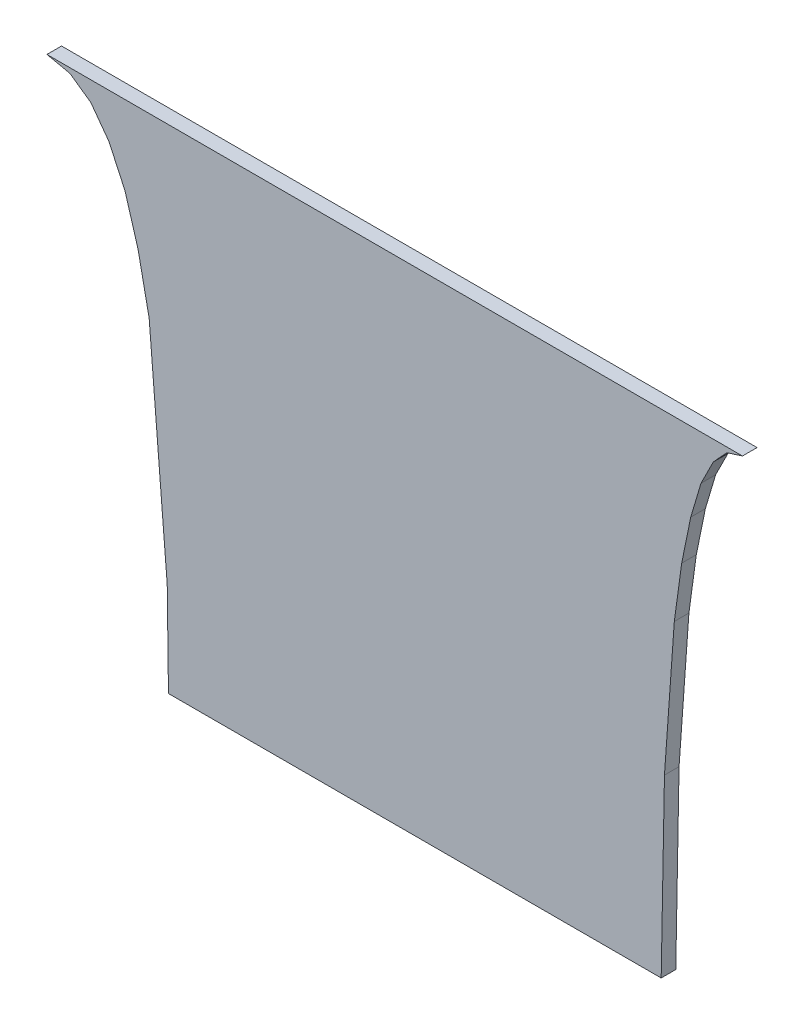
ISO-10303-21;
HEADER;
FILE_DESCRIPTION(('STEP AP214'),'2;1');
FILE_NAME('part.step','',(''),(''),'','','');
FILE_SCHEMA(('AUTOMOTIVE_DESIGN { 1 0 10303 214 1 1 1 1 }'));
ENDSEC;
DATA;
#1=APPLICATION_CONTEXT('core data for automotive mechanical design processes');
#2=APPLICATION_PROTOCOL_DEFINITION('international standard','automotive_design',2000,#1);
#3=PRODUCT_CONTEXT('',#1,'mechanical');
#4=PRODUCT('Part','Part','',(#3));
#5=PRODUCT_RELATED_PRODUCT_CATEGORY('part','',(#4));
#6=PRODUCT_DEFINITION_FORMATION('','',#4);
#7=PRODUCT_DEFINITION_CONTEXT('part definition',#1,'design');
#8=PRODUCT_DEFINITION('design','',#6,#7);
#9=PRODUCT_DEFINITION_SHAPE('','',#8);
#10=(LENGTH_UNIT() NAMED_UNIT(*) SI_UNIT(.MILLI.,.METRE.));
#11=(NAMED_UNIT(*) PLANE_ANGLE_UNIT() SI_UNIT($,.RADIAN.));
#12=(NAMED_UNIT(*) SI_UNIT($,.STERADIAN.) SOLID_ANGLE_UNIT());
#13=UNCERTAINTY_MEASURE_WITH_UNIT(LENGTH_MEASURE(1.E-05),#10,'distance_accuracy_value','');
#14=(GEOMETRIC_REPRESENTATION_CONTEXT(3) GLOBAL_UNCERTAINTY_ASSIGNED_CONTEXT((#13)) GLOBAL_UNIT_ASSIGNED_CONTEXT((#10,
#11,#12)) REPRESENTATION_CONTEXT('',''));
#15=CARTESIAN_POINT('',(0.,0.,0.));
#16=DIRECTION('',(0.,0.,1.));
#17=DIRECTION('',(1.,0.,0.));
#18=AXIS2_PLACEMENT_3D('',#15,#16,#17);
#19=CARTESIAN_POINT('',(67.4290008544922,88.5329971313477,0.));
#20=DIRECTION('',(-0.999828763927862,0.0185052106846405,0.));
#21=DIRECTION('',(0.0185052106846405,0.999828763927862,0.));
#22=AXIS2_PLACEMENT_3D('',#19,#20,#21);
#23=PLANE('',#22);
#24=DIRECTION('',(0.0185052106846405,0.999828763927862,0.));
#25=VECTOR('',#24,1.);
#26=CARTESIAN_POINT('',(67.4290008544922,88.5329971313477,0.03556));
#27=LINE('',#26,#25);
#28=CARTESIAN_POINT('',(67.4290008544922,88.5329971313477,0.03556));
#29=VERTEX_POINT('',#28);
#30=CARTESIAN_POINT('',(67.4369964599609,88.9649963378906,0.03556));
#31=VERTEX_POINT('',#30);
#32=EDGE_CURVE('E11',#29,#31,#27,.T.);
#33=ORIENTED_EDGE('',*,*,#32,.F.);
#34=DIRECTION('',(0.,0.,1.));
#35=VECTOR('',#34,1.);
#36=CARTESIAN_POINT('',(67.4290008544922,88.5329971313477,0.));
#37=LINE('',#36,#35);
#38=CARTESIAN_POINT('',(67.4290008544922,88.5329971313477,0.));
#39=VERTEX_POINT('',#38);
#40=EDGE_CURVE('E24',#39,#29,#37,.T.);
#41=ORIENTED_EDGE('',*,*,#40,.F.);
#42=DIRECTION('',(0.0185052106846405,0.999828763927862,0.));
#43=VECTOR('',#42,1.);
#44=CARTESIAN_POINT('',(67.4290008544922,88.5329971313477,0.));
#45=LINE('',#44,#43);
#46=CARTESIAN_POINT('',(67.4369964599609,88.9649963378906,0.));
#47=VERTEX_POINT('',#46);
#48=EDGE_CURVE('E160',#39,#47,#45,.T.);
#49=ORIENTED_EDGE('',*,*,#48,.T.);
#50=DIRECTION('',(0.,0.,1.));
#51=VECTOR('',#50,1.);
#52=CARTESIAN_POINT('',(67.4369964599609,88.9649963378906,0.));
#53=LINE('',#52,#51);
#54=EDGE_CURVE('E37',#47,#31,#53,.T.);
#55=ORIENTED_EDGE('',*,*,#54,.T.);
#56=EDGE_LOOP('',(#33,#41,#49,#55));
#57=FACE_BOUND('',#56,.T.);
#58=ADVANCED_FACE('F17',(#57),#23,.F.);
#59=CARTESIAN_POINT('',(67.4369964599609,88.9649963378906,0.));
#60=DIRECTION('',(-0.997458354919496,0.0712518785807937,0.));
#61=DIRECTION('',(0.0712518785807937,0.997458354919496,0.));
#62=AXIS2_PLACEMENT_3D('',#59,#60,#61);
#63=PLANE('',#62);
#64=DIRECTION('',(0.0712518785807937,0.997458354919496,0.));
#65=VECTOR('',#64,1.);
#66=CARTESIAN_POINT('',(67.4369964599609,88.9649963378906,0.03556));
#67=LINE('',#66,#65);
#68=CARTESIAN_POINT('',(67.4609985351562,89.3010025024414,0.03556));
#69=VERTEX_POINT('',#68);
#70=EDGE_CURVE('E280',#31,#69,#67,.T.);
#71=ORIENTED_EDGE('',*,*,#70,.F.);
#72=ORIENTED_EDGE('',*,*,#54,.F.);
#73=DIRECTION('',(0.0712518785807937,0.997458354919496,0.));
#74=VECTOR('',#73,1.);
#75=CARTESIAN_POINT('',(67.4369964599609,88.9649963378906,0.));
#76=LINE('',#75,#74);
#77=CARTESIAN_POINT('',(67.4609985351562,89.3010025024414,0.));
#78=VERTEX_POINT('',#77);
#79=EDGE_CURVE('E277',#47,#78,#76,.T.);
#80=ORIENTED_EDGE('',*,*,#79,.T.);
#81=DIRECTION('',(0.,0.,1.));
#82=VECTOR('',#81,1.);
#83=CARTESIAN_POINT('',(67.4609985351562,89.3010025024414,0.));
#84=LINE('',#83,#82);
#85=EDGE_CURVE('E275',#78,#69,#84,.T.);
#86=ORIENTED_EDGE('',*,*,#85,.T.);
#87=EDGE_LOOP('',(#71,#72,#80,#86));
#88=FACE_BOUND('',#87,.T.);
#89=ADVANCED_FACE('F288',(#88),#63,.F.);
#90=CARTESIAN_POINT('',(67.4609985351562,89.3010025024414,0.));
#91=DIRECTION('',(-0.990831910463232,0.135100426378982,0.));
#92=DIRECTION('',(0.135100426378982,0.990831910463232,0.));
#93=AXIS2_PLACEMENT_3D('',#90,#91,#92);
#94=PLANE('',#93);
#95=DIRECTION('',(0.135100426378982,0.990831910463231,0.));
#96=VECTOR('',#95,1.);
#97=CARTESIAN_POINT('',(67.4609985351562,89.3010025024414,0.03556));
#98=LINE('',#97,#96);
#99=CARTESIAN_POINT('',(67.4789962768555,89.4329986572265,0.03556));
#100=VERTEX_POINT('',#99);
#101=EDGE_CURVE('E272',#69,#100,#98,.T.);
#102=ORIENTED_EDGE('',*,*,#101,.F.);
#103=ORIENTED_EDGE('',*,*,#85,.F.);
#104=DIRECTION('',(0.135100426378982,0.990831910463231,0.));
#105=VECTOR('',#104,1.);
#106=CARTESIAN_POINT('',(67.4609985351562,89.3010025024414,0.));
#107=LINE('',#106,#105);
#108=CARTESIAN_POINT('',(67.4789962768555,89.4329986572265,0.));
#109=VERTEX_POINT('',#108);
#110=EDGE_CURVE('E269',#78,#109,#107,.T.);
#111=ORIENTED_EDGE('',*,*,#110,.T.);
#112=DIRECTION('',(0.,0.,1.));
#113=VECTOR('',#112,1.);
#114=CARTESIAN_POINT('',(67.4789962768555,89.4329986572265,0.));
#115=LINE('',#114,#113);
#116=EDGE_CURVE('E267',#109,#100,#115,.T.);
#117=ORIENTED_EDGE('',*,*,#116,.T.);
#118=EDGE_LOOP('',(#102,#103,#111,#117));
#119=FACE_BOUND('',#118,.T.);
#120=ADVANCED_FACE('F294',(#119),#94,.F.);
#121=CARTESIAN_POINT('',(67.4789962768555,89.4329986572265,0.));
#122=DIRECTION('',(-0.979871534143143,0.199629097518284,0.));
#123=DIRECTION('',(0.199629097518284,0.979871534143143,0.));
#124=AXIS2_PLACEMENT_3D('',#121,#122,#123);
#125=PLANE('',#124);
#126=DIRECTION('',(0.199629097518284,0.979871534143143,0.));
#127=VECTOR('',#126,1.);
#128=CARTESIAN_POINT('',(67.4789962768555,89.4329986572265,0.03556));
#129=LINE('',#128,#127);
#130=CARTESIAN_POINT('',(67.5009994506836,89.5410003662109,0.03556));
#131=VERTEX_POINT('',#130);
#132=EDGE_CURVE('E264',#100,#131,#129,.T.);
#133=ORIENTED_EDGE('',*,*,#132,.F.);
#134=ORIENTED_EDGE('',*,*,#116,.F.);
#135=DIRECTION('',(0.199629097518284,0.979871534143143,0.));
#136=VECTOR('',#135,1.);
#137=CARTESIAN_POINT('',(67.4789962768555,89.4329986572265,0.));
#138=LINE('',#137,#136);
#139=CARTESIAN_POINT('',(67.5009994506836,89.5410003662109,0.));
#140=VERTEX_POINT('',#139);
#141=EDGE_CURVE('E261',#109,#140,#138,.T.);
#142=ORIENTED_EDGE('',*,*,#141,.T.);
#143=DIRECTION('',(0.,0.,1.));
#144=VECTOR('',#143,1.);
#145=CARTESIAN_POINT('',(67.5009994506836,89.5410003662109,0.));
#146=LINE('',#145,#144);
#147=EDGE_CURVE('E259',#140,#131,#146,.T.);
#148=ORIENTED_EDGE('',*,*,#147,.T.);
#149=EDGE_LOOP('',(#133,#134,#142,#148));
#150=FACE_BOUND('',#149,.T.);
#151=ADVANCED_FACE('F296',(#150),#125,.F.);
#152=CARTESIAN_POINT('',(67.5009994506836,89.541000366211,0.));
#153=DIRECTION('',(-0.958446978225307,0.285270730939539,0.));
#154=DIRECTION('',(0.285270730939539,0.958446978225307,0.));
#155=AXIS2_PLACEMENT_3D('',#152,#153,#154);
#156=PLANE('',#155);
#157=DIRECTION('',(0.285270730939539,0.958446978225306,0.));
#158=VECTOR('',#157,1.);
#159=CARTESIAN_POINT('',(67.5009994506836,89.5410003662109,0.03556));
#160=LINE('',#159,#158);
#161=CARTESIAN_POINT('',(67.5260009765625,89.625,0.03556));
#162=VERTEX_POINT('',#161);
#163=EDGE_CURVE('E256',#131,#162,#160,.T.);
#164=ORIENTED_EDGE('',*,*,#163,.F.);
#165=ORIENTED_EDGE('',*,*,#147,.F.);
#166=DIRECTION('',(0.285270730939539,0.958446978225306,0.));
#167=VECTOR('',#166,1.);
#168=CARTESIAN_POINT('',(67.5009994506836,89.5410003662109,0.));
#169=LINE('',#168,#167);
#170=CARTESIAN_POINT('',(67.5260009765625,89.625,0.));
#171=VERTEX_POINT('',#170);
#172=EDGE_CURVE('E253',#140,#171,#169,.T.);
#173=ORIENTED_EDGE('',*,*,#172,.T.);
#174=DIRECTION('',(0.,0.,1.));
#175=VECTOR('',#174,1.);
#176=CARTESIAN_POINT('',(67.5260009765625,89.625,0.));
#177=LINE('',#176,#175);
#178=EDGE_CURVE('E251',#171,#162,#177,.T.);
#179=ORIENTED_EDGE('',*,*,#178,.T.);
#180=EDGE_LOOP('',(#164,#165,#173,#179));
#181=FACE_BOUND('',#180,.T.);
#182=ADVANCED_FACE('F301',(#181),#156,.F.);
#183=CARTESIAN_POINT('',(67.5260009765625,89.625,0.));
#184=DIRECTION('',(-0.894427190999916,0.447213595499958,0.));
#185=DIRECTION('',(0.447213595499958,0.894427190999916,0.));
#186=AXIS2_PLACEMENT_3D('',#183,#184,#185);
#187=PLANE('',#186);
#188=DIRECTION('',(0.447213595499958,0.894427190999916,0.));
#189=VECTOR('',#188,1.);
#190=CARTESIAN_POINT('',(67.5260009765625,89.625,0.03556));
#191=LINE('',#190,#189);
#192=CARTESIAN_POINT('',(67.5559997558594,89.6849975585938,0.03556));
#193=VERTEX_POINT('',#192);
#194=EDGE_CURVE('E248',#162,#193,#191,.T.);
#195=ORIENTED_EDGE('',*,*,#194,.F.);
#196=ORIENTED_EDGE('',*,*,#178,.F.);
#197=DIRECTION('',(0.447213595499958,0.894427190999916,0.));
#198=VECTOR('',#197,1.);
#199=CARTESIAN_POINT('',(67.5260009765625,89.625,0.));
#200=LINE('',#199,#198);
#201=CARTESIAN_POINT('',(67.5559997558594,89.6849975585938,0.));
#202=VERTEX_POINT('',#201);
#203=EDGE_CURVE('E245',#171,#202,#200,.T.);
#204=ORIENTED_EDGE('',*,*,#203,.T.);
#205=DIRECTION('',(0.,0.,1.));
#206=VECTOR('',#205,1.);
#207=CARTESIAN_POINT('',(67.5559997558594,89.6849975585938,0.));
#208=LINE('',#207,#206);
#209=EDGE_CURVE('E243',#202,#193,#208,.T.);
#210=ORIENTED_EDGE('',*,*,#209,.T.);
#211=EDGE_LOOP('',(#195,#196,#204,#210));
#212=FACE_BOUND('',#211,.T.);
#213=ADVANCED_FACE('F304',(#212),#187,.F.);
#214=CARTESIAN_POINT('',(67.5559997558594,89.6849975585938,0.));
#215=DIRECTION('',(-0.73721249970218,0.675660958086867,0.));
#216=DIRECTION('',(0.675660958086867,0.73721249970218,0.));
#217=AXIS2_PLACEMENT_3D('',#214,#215,#216);
#218=PLANE('',#217);
#219=DIRECTION('',(0.675660958086867,0.73721249970218,0.));
#220=VECTOR('',#219,1.);
#221=CARTESIAN_POINT('',(67.5559997558594,89.6849975585938,0.03556));
#222=LINE('',#221,#220);
#223=CARTESIAN_POINT('',(67.588996887207,89.7210006713867,0.03556));
#224=VERTEX_POINT('',#223);
#225=EDGE_CURVE('E240',#193,#224,#222,.T.);
#226=ORIENTED_EDGE('',*,*,#225,.F.);
#227=ORIENTED_EDGE('',*,*,#209,.F.);
#228=DIRECTION('',(0.675660958086867,0.73721249970218,0.));
#229=VECTOR('',#228,1.);
#230=CARTESIAN_POINT('',(67.5559997558594,89.6849975585938,0.));
#231=LINE('',#230,#229);
#232=CARTESIAN_POINT('',(67.588996887207,89.7210006713867,0.));
#233=VERTEX_POINT('',#232);
#234=EDGE_CURVE('E237',#202,#233,#231,.T.);
#235=ORIENTED_EDGE('',*,*,#234,.T.);
#236=DIRECTION('',(0.,0.,1.));
#237=VECTOR('',#236,1.);
#238=CARTESIAN_POINT('',(67.588996887207,89.7210006713867,0.));
#239=LINE('',#238,#237);
#240=EDGE_CURVE('E235',#233,#224,#239,.T.);
#241=ORIENTED_EDGE('',*,*,#240,.T.);
#242=EDGE_LOOP('',(#226,#227,#235,#241));
#243=FACE_BOUND('',#242,.T.);
#244=ADVANCED_FACE('F309',(#243),#218,.F.);
#245=CARTESIAN_POINT('',(67.588996887207,89.7210006713867,0.));
#246=DIRECTION('',(-0.301140530203673,0.953579771738396,0.));
#247=DIRECTION('',(0.953579771738396,0.301140530203673,0.));
#248=AXIS2_PLACEMENT_3D('',#245,#246,#247);
#249=PLANE('',#248);
#250=DIRECTION('',(0.953579771738395,0.301140530203673,0.));
#251=VECTOR('',#250,1.);
#252=CARTESIAN_POINT('',(67.588996887207,89.7210006713867,0.03556));
#253=LINE('',#252,#251);
#254=CARTESIAN_POINT('',(67.6269989013672,89.7330017089844,0.03556));
#255=VERTEX_POINT('',#254);
#256=EDGE_CURVE('E232',#224,#255,#253,.T.);
#257=ORIENTED_EDGE('',*,*,#256,.F.);
#258=ORIENTED_EDGE('',*,*,#240,.F.);
#259=DIRECTION('',(0.953579771738395,0.301140530203673,0.));
#260=VECTOR('',#259,1.);
#261=CARTESIAN_POINT('',(67.588996887207,89.7210006713867,0.));
#262=LINE('',#261,#260);
#263=CARTESIAN_POINT('',(67.6269989013672,89.7330017089844,0.));
#264=VERTEX_POINT('',#263);
#265=EDGE_CURVE('E229',#233,#264,#262,.T.);
#266=ORIENTED_EDGE('',*,*,#265,.T.);
#267=DIRECTION('',(0.,0.,1.));
#268=VECTOR('',#267,1.);
#269=CARTESIAN_POINT('',(67.6269989013672,89.7330017089844,0.));
#270=LINE('',#269,#268);
#271=EDGE_CURVE('E227',#264,#255,#270,.T.);
#272=ORIENTED_EDGE('',*,*,#271,.T.);
#273=EDGE_LOOP('',(#257,#258,#266,#272));
#274=FACE_BOUND('',#273,.T.);
#275=ADVANCED_FACE('F312',(#274),#249,.F.);
#276=CARTESIAN_POINT('',(67.6269989013672,89.7330017089844,0.));
#277=DIRECTION('',(0.,-1.,0.));
#278=DIRECTION('',(-1.,0.,0.));
#279=AXIS2_PLACEMENT_3D('',#276,#277,#278);
#280=PLANE('',#279);
#281=DIRECTION('',(-1.,0.,0.));
#282=VECTOR('',#281,1.);
#283=CARTESIAN_POINT('',(67.6269989013672,89.7330017089844,0.03556));
#284=LINE('',#283,#282);
#285=CARTESIAN_POINT('',(65.9329986572266,89.7330017089844,0.03556));
#286=VERTEX_POINT('',#285);
#287=EDGE_CURVE('E224',#255,#286,#284,.T.);
#288=ORIENTED_EDGE('',*,*,#287,.F.);
#289=ORIENTED_EDGE('',*,*,#271,.F.);
#290=DIRECTION('',(-1.,0.,0.));
#291=VECTOR('',#290,1.);
#292=CARTESIAN_POINT('',(67.6269989013672,89.7330017089844,0.));
#293=LINE('',#292,#291);
#294=CARTESIAN_POINT('',(65.9329986572266,89.7330017089844,0.));
#295=VERTEX_POINT('',#294);
#296=EDGE_CURVE('E221',#264,#295,#293,.T.);
#297=ORIENTED_EDGE('',*,*,#296,.T.);
#298=DIRECTION('',(0.,0.,1.));
#299=VECTOR('',#298,1.);
#300=CARTESIAN_POINT('',(65.9329986572266,89.7330017089844,0.));
#301=LINE('',#300,#299);
#302=EDGE_CURVE('E219',#295,#286,#301,.T.);
#303=ORIENTED_EDGE('',*,*,#302,.T.);
#304=EDGE_LOOP('',(#288,#289,#297,#303));
#305=FACE_BOUND('',#304,.T.);
#306=ADVANCED_FACE('F317',(#305),#280,.F.);
#307=CARTESIAN_POINT('',(65.9329986572266,89.7330017089844,0.));
#308=DIRECTION('',(0.20954728392183,0.977798514930854,0.));
#309=DIRECTION('',(0.977798514930854,-0.20954728392183,0.));
#310=AXIS2_PLACEMENT_3D('',#307,#308,#309);
#311=PLANE('',#310);
#312=DIRECTION('',(0.977798514930854,-0.20954728392183,0.));
#313=VECTOR('',#312,1.);
#314=CARTESIAN_POINT('',(65.9329986572266,89.7330017089844,0.03556));
#315=LINE('',#314,#313);
#316=CARTESIAN_POINT('',(65.9889984130859,89.7210006713867,0.03556));
#317=VERTEX_POINT('',#316);
#318=EDGE_CURVE('E216',#286,#317,#315,.T.);
#319=ORIENTED_EDGE('',*,*,#318,.F.);
#320=ORIENTED_EDGE('',*,*,#302,.F.);
#321=DIRECTION('',(0.977798514930854,-0.20954728392183,0.));
#322=VECTOR('',#321,1.);
#323=CARTESIAN_POINT('',(65.9329986572266,89.7330017089844,0.));
#324=LINE('',#323,#322);
#325=CARTESIAN_POINT('',(65.9889984130859,89.7210006713867,0.));
#326=VERTEX_POINT('',#325);
#327=EDGE_CURVE('E213',#295,#326,#324,.T.);
#328=ORIENTED_EDGE('',*,*,#327,.T.);
#329=DIRECTION('',(0.,0.,1.));
#330=VECTOR('',#329,1.);
#331=CARTESIAN_POINT('',(65.9889984130859,89.7210006713867,0.));
#332=LINE('',#331,#330);
#333=EDGE_CURVE('E211',#326,#317,#332,.T.);
#334=ORIENTED_EDGE('',*,*,#333,.T.);
#335=EDGE_LOOP('',(#319,#320,#328,#334));
#336=FACE_BOUND('',#335,.T.);
#337=ADVANCED_FACE('F320',(#336),#311,.F.);
#338=CARTESIAN_POINT('',(65.9889984130859,89.7210006713867,0.));
#339=DIRECTION('',(0.576697591474071,0.816957702692131,0.));
#340=DIRECTION('',(0.816957702692131,-0.576697591474071,0.));
#341=AXIS2_PLACEMENT_3D('',#338,#339,#340);
#342=PLANE('',#341);
#343=DIRECTION('',(0.816957702692131,-0.576697591474071,0.));
#344=VECTOR('',#343,1.);
#345=CARTESIAN_POINT('',(65.9889984130859,89.7210006713867,0.03556));
#346=LINE('',#345,#344);
#347=CARTESIAN_POINT('',(66.0400009155273,89.6849975585938,0.03556));
#348=VERTEX_POINT('',#347);
#349=EDGE_CURVE('E208',#317,#348,#346,.T.);
#350=ORIENTED_EDGE('',*,*,#349,.F.);
#351=ORIENTED_EDGE('',*,*,#333,.F.);
#352=DIRECTION('',(0.816957702692131,-0.576697591474071,0.));
#353=VECTOR('',#352,1.);
#354=CARTESIAN_POINT('',(65.9889984130859,89.7210006713867,0.));
#355=LINE('',#354,#353);
#356=CARTESIAN_POINT('',(66.0400009155273,89.6849975585938,0.));
#357=VERTEX_POINT('',#356);
#358=EDGE_CURVE('E205',#326,#357,#355,.T.);
#359=ORIENTED_EDGE('',*,*,#358,.T.);
#360=DIRECTION('',(0.,0.,1.));
#361=VECTOR('',#360,1.);
#362=CARTESIAN_POINT('',(66.0400009155273,89.6849975585938,0.));
#363=LINE('',#362,#361);
#364=EDGE_CURVE('E203',#357,#348,#363,.T.);
#365=ORIENTED_EDGE('',*,*,#364,.T.);
#366=EDGE_LOOP('',(#350,#351,#359,#365));
#367=FACE_BOUND('',#366,.T.);
#368=ADVANCED_FACE('F325',(#367),#342,.F.);
#369=CARTESIAN_POINT('',(66.0400009155273,89.6849975585938,0.));
#370=DIRECTION('',(0.806401735791392,0.591368109144069,0.));
#371=DIRECTION('',(0.591368109144069,-0.806401735791392,0.));
#372=AXIS2_PLACEMENT_3D('',#369,#370,#371);
#373=PLANE('',#372);
#374=DIRECTION('',(0.591368109144069,-0.806401735791391,0.));
#375=VECTOR('',#374,1.);
#376=CARTESIAN_POINT('',(66.0400009155273,89.6849975585938,0.03556));
#377=LINE('',#376,#375);
#378=CARTESIAN_POINT('',(66.0839996337891,89.625,0.03556));
#379=VERTEX_POINT('',#378);
#380=EDGE_CURVE('E200',#348,#379,#377,.T.);
#381=ORIENTED_EDGE('',*,*,#380,.F.);
#382=ORIENTED_EDGE('',*,*,#364,.F.);
#383=DIRECTION('',(0.591368109144069,-0.806401735791391,0.));
#384=VECTOR('',#383,1.);
#385=CARTESIAN_POINT('',(66.0400009155273,89.6849975585938,0.));
#386=LINE('',#385,#384);
#387=CARTESIAN_POINT('',(66.0839996337891,89.625,0.));
#388=VERTEX_POINT('',#387);
#389=EDGE_CURVE('E197',#357,#388,#386,.T.);
#390=ORIENTED_EDGE('',*,*,#389,.T.);
#391=DIRECTION('',(0.,0.,1.));
#392=VECTOR('',#391,1.);
#393=CARTESIAN_POINT('',(66.0839996337891,89.625,0.));
#394=LINE('',#393,#392);
#395=EDGE_CURVE('E195',#388,#379,#394,.T.);
#396=ORIENTED_EDGE('',*,*,#395,.T.);
#397=EDGE_LOOP('',(#381,#382,#390,#396));
#398=FACE_BOUND('',#397,.T.);
#399=ADVANCED_FACE('F328',(#398),#373,.F.);
#400=CARTESIAN_POINT('',(66.0839996337891,89.625,0.));
#401=DIRECTION('',(0.907002225104529,0.421125828767879,0.));
#402=DIRECTION('',(0.421125828767879,-0.907002225104529,0.));
#403=AXIS2_PLACEMENT_3D('',#400,#401,#402);
#404=PLANE('',#403);
#405=DIRECTION('',(0.421125828767879,-0.907002225104529,0.));
#406=VECTOR('',#405,1.);
#407=CARTESIAN_POINT('',(66.0839996337891,89.625,0.03556));
#408=LINE('',#407,#406);
#409=CARTESIAN_POINT('',(66.1230010986328,89.5410003662109,0.03556));
#410=VERTEX_POINT('',#409);
#411=EDGE_CURVE('E192',#379,#410,#408,.T.);
#412=ORIENTED_EDGE('',*,*,#411,.F.);
#413=ORIENTED_EDGE('',*,*,#395,.F.);
#414=DIRECTION('',(0.421125828767879,-0.907002225104529,0.));
#415=VECTOR('',#414,1.);
#416=CARTESIAN_POINT('',(66.0839996337891,89.625,0.));
#417=LINE('',#416,#415);
#418=CARTESIAN_POINT('',(66.1230010986328,89.5410003662109,0.));
#419=VERTEX_POINT('',#418);
#420=EDGE_CURVE('E189',#388,#419,#417,.T.);
#421=ORIENTED_EDGE('',*,*,#420,.T.);
#422=DIRECTION('',(0.,0.,1.));
#423=VECTOR('',#422,1.);
#424=CARTESIAN_POINT('',(66.1230010986328,89.5410003662109,0.));
#425=LINE('',#424,#423);
#426=EDGE_CURVE('E187',#419,#410,#425,.T.);
#427=ORIENTED_EDGE('',*,*,#426,.T.);
#428=EDGE_LOOP('',(#412,#413,#421,#427));
#429=FACE_BOUND('',#428,.T.);
#430=ADVANCED_FACE('F333',(#429),#404,.F.);
#431=CARTESIAN_POINT('',(66.1230010986328,89.541000366211,0.));
#432=DIRECTION('',(0.958804945353808,0.284065268494904,0.));
#433=DIRECTION('',(0.284065268494904,-0.958804945353808,0.));
#434=AXIS2_PLACEMENT_3D('',#431,#432,#433);
#435=PLANE('',#434);
#436=DIRECTION('',(0.284065268494904,-0.958804945353808,0.));
#437=VECTOR('',#436,1.);
#438=CARTESIAN_POINT('',(66.1230010986328,89.5410003662109,0.03556));
#439=LINE('',#438,#437);
#440=CARTESIAN_POINT('',(66.1549987792969,89.4329986572265,0.03556));
#441=VERTEX_POINT('',#440);
#442=EDGE_CURVE('E184',#410,#441,#439,.T.);
#443=ORIENTED_EDGE('',*,*,#442,.F.);
#444=ORIENTED_EDGE('',*,*,#426,.F.);
#445=DIRECTION('',(0.284065268494904,-0.958804945353808,0.));
#446=VECTOR('',#445,1.);
#447=CARTESIAN_POINT('',(66.1230010986328,89.5410003662109,0.));
#448=LINE('',#447,#446);
#449=CARTESIAN_POINT('',(66.1549987792969,89.4329986572265,0.));
#450=VERTEX_POINT('',#449);
#451=EDGE_CURVE('E181',#419,#450,#448,.T.);
#452=ORIENTED_EDGE('',*,*,#451,.T.);
#453=DIRECTION('',(0.,0.,1.));
#454=VECTOR('',#453,1.);
#455=CARTESIAN_POINT('',(66.1549987792969,89.4329986572265,0.));
#456=LINE('',#455,#454);
#457=EDGE_CURVE('E179',#450,#441,#456,.T.);
#458=ORIENTED_EDGE('',*,*,#457,.T.);
#459=EDGE_LOOP('',(#443,#444,#452,#458));
#460=FACE_BOUND('',#459,.T.);
#461=ADVANCED_FACE('F336',(#460),#435,.F.);
#462=CARTESIAN_POINT('',(66.1549987792969,89.4329986572265,0.));
#463=DIRECTION('',(0.979713163510958,0.200404883282196,0.));
#464=DIRECTION('',(0.200404883282196,-0.979713163510958,0.));
#465=AXIS2_PLACEMENT_3D('',#462,#463,#464);
#466=PLANE('',#465);
#467=DIRECTION('',(0.200404883282196,-0.979713163510958,0.));
#468=VECTOR('',#467,1.);
#469=CARTESIAN_POINT('',(66.1549987792969,89.4329986572265,0.03556));
#470=LINE('',#469,#468);
#471=CARTESIAN_POINT('',(66.181999206543,89.3010025024414,0.03556));
#472=VERTEX_POINT('',#471);
#473=EDGE_CURVE('E176',#441,#472,#470,.T.);
#474=ORIENTED_EDGE('',*,*,#473,.F.);
#475=ORIENTED_EDGE('',*,*,#457,.F.);
#476=DIRECTION('',(0.200404883282196,-0.979713163510958,0.));
#477=VECTOR('',#476,1.);
#478=CARTESIAN_POINT('',(66.1549987792969,89.4329986572265,0.));
#479=LINE('',#478,#477);
#480=CARTESIAN_POINT('',(66.181999206543,89.3010025024414,0.));
#481=VERTEX_POINT('',#480);
#482=EDGE_CURVE('E173',#450,#481,#479,.T.);
#483=ORIENTED_EDGE('',*,*,#482,.T.);
#484=DIRECTION('',(0.,0.,1.));
#485=VECTOR('',#484,1.);
#486=CARTESIAN_POINT('',(66.181999206543,89.3010025024414,0.));
#487=LINE('',#486,#485);
#488=EDGE_CURVE('E171',#481,#472,#487,.T.);
#489=ORIENTED_EDGE('',*,*,#488,.T.);
#490=EDGE_LOOP('',(#474,#475,#483,#489));
#491=FACE_BOUND('',#490,.T.);
#492=ADVANCED_FACE('F341',(#491),#466,.F.);
#493=CARTESIAN_POINT('',(66.181999206543,89.3010025024414,0.));
#494=DIRECTION('',(0.996697025571536,0.08120984679737,0.));
#495=DIRECTION('',(0.08120984679737,-0.996697025571536,0.));
#496=AXIS2_PLACEMENT_3D('',#493,#494,#495);
#497=PLANE('',#496);
#498=DIRECTION('',(0.08120984679737,-0.996697025571536,0.));
#499=VECTOR('',#498,1.);
#500=CARTESIAN_POINT('',(66.181999206543,89.3010025024414,0.03556));
#501=LINE('',#500,#499);
#502=CARTESIAN_POINT('',(66.2259979248047,88.7610015869141,0.03556));
#503=VERTEX_POINT('',#502);
#504=EDGE_CURVE('E168',#472,#503,#501,.T.);
#505=ORIENTED_EDGE('',*,*,#504,.F.);
#506=ORIENTED_EDGE('',*,*,#488,.F.);
#507=DIRECTION('',(0.08120984679737,-0.996697025571536,0.));
#508=VECTOR('',#507,1.);
#509=CARTESIAN_POINT('',(66.181999206543,89.3010025024414,0.));
#510=LINE('',#509,#508);
#511=CARTESIAN_POINT('',(66.2259979248047,88.7610015869141,0.));
#512=VERTEX_POINT('',#511);
#513=EDGE_CURVE('E166',#481,#512,#510,.T.);
#514=ORIENTED_EDGE('',*,*,#513,.T.);
#515=DIRECTION('',(0.,0.,1.));
#516=VECTOR('',#515,1.);
#517=CARTESIAN_POINT('',(66.2259979248047,88.7610015869141,0.));
#518=LINE('',#517,#516);
#519=EDGE_CURVE('E151',#512,#503,#518,.T.);
#520=ORIENTED_EDGE('',*,*,#519,.T.);
#521=EDGE_LOOP('',(#505,#506,#514,#520));
#522=FACE_BOUND('',#521,.T.);
#523=ADVANCED_FACE('F343',(#522),#497,.F.);
#524=CARTESIAN_POINT('',(66.2259979248047,88.7610015869141,0.));
#525=DIRECTION('',(0.999913544572774,0.0131492729803279,0.));
#526=DIRECTION('',(0.0131492729803279,-0.999913544572774,0.));
#527=AXIS2_PLACEMENT_3D('',#524,#525,#526);
#528=PLANE('',#527);
#529=DIRECTION('',(0.0131492729803279,-0.999913544572774,0.));
#530=VECTOR('',#529,1.);
#531=CARTESIAN_POINT('',(66.2259979248047,88.7610015869141,0.03556));
#532=LINE('',#531,#530);
#533=CARTESIAN_POINT('',(66.2289962768555,88.5329971313477,0.03556));
#534=VERTEX_POINT('',#533);
#535=EDGE_CURVE('E155',#503,#534,#532,.T.);
#536=ORIENTED_EDGE('',*,*,#535,.F.);
#537=ORIENTED_EDGE('',*,*,#519,.F.);
#538=DIRECTION('',(0.0131492729803279,-0.999913544572774,0.));
#539=VECTOR('',#538,1.);
#540=CARTESIAN_POINT('',(66.2259979248047,88.7610015869141,0.));
#541=LINE('',#540,#539);
#542=CARTESIAN_POINT('',(66.2289962768555,88.5329971313477,0.));
#543=VERTEX_POINT('',#542);
#544=EDGE_CURVE('E147',#512,#543,#541,.T.);
#545=ORIENTED_EDGE('',*,*,#544,.T.);
#546=DIRECTION('',(0.,0.,1.));
#547=VECTOR('',#546,1.);
#548=CARTESIAN_POINT('',(66.2289962768555,88.5329971313477,0.));
#549=LINE('',#548,#547);
#550=EDGE_CURVE('E137',#543,#534,#549,.T.);
#551=ORIENTED_EDGE('',*,*,#550,.T.);
#552=EDGE_LOOP('',(#536,#537,#545,#551));
#553=FACE_BOUND('',#552,.T.);
#554=ADVANCED_FACE('F150',(#553),#528,.F.);
#555=CARTESIAN_POINT('',(66.2289962768555,88.5329971313477,0.));
#556=DIRECTION('',(0.,1.,0.));
#557=DIRECTION('',(1.,0.,0.));
#558=AXIS2_PLACEMENT_3D('',#555,#556,#557);
#559=PLANE('',#558);
#560=DIRECTION('',(1.,0.,0.));
#561=VECTOR('',#560,1.);
#562=CARTESIAN_POINT('',(66.2289962768555,88.5329971313477,0.03556));
#563=LINE('',#562,#561);
#564=EDGE_CURVE('E143',#534,#29,#563,.T.);
#565=ORIENTED_EDGE('',*,*,#564,.F.);
#566=ORIENTED_EDGE('',*,*,#550,.F.);
#567=DIRECTION('',(1.,0.,0.));
#568=VECTOR('',#567,1.);
#569=CARTESIAN_POINT('',(66.2289962768555,88.5329971313477,0.));
#570=LINE('',#569,#568);
#571=EDGE_CURVE('E141',#543,#39,#570,.T.);
#572=ORIENTED_EDGE('',*,*,#571,.T.);
#573=ORIENTED_EDGE('',*,*,#40,.T.);
#574=EDGE_LOOP('',(#565,#566,#572,#573));
#575=FACE_BOUND('',#574,.T.);
#576=ADVANCED_FACE('F139',(#575),#559,.F.);
#577=CARTESIAN_POINT('',(67.4290008544922,88.5329971313477,0.));
#578=DIRECTION('',(0.,0.,1.));
#579=DIRECTION('',(1.,0.,0.));
#580=AXIS2_PLACEMENT_3D('',#577,#578,#579);
#581=PLANE('',#580);
#582=ORIENTED_EDGE('',*,*,#571,.F.);
#583=ORIENTED_EDGE('',*,*,#544,.F.);
#584=ORIENTED_EDGE('',*,*,#513,.F.);
#585=ORIENTED_EDGE('',*,*,#482,.F.);
#586=ORIENTED_EDGE('',*,*,#451,.F.);
#587=ORIENTED_EDGE('',*,*,#420,.F.);
#588=ORIENTED_EDGE('',*,*,#389,.F.);
#589=ORIENTED_EDGE('',*,*,#358,.F.);
#590=ORIENTED_EDGE('',*,*,#327,.F.);
#591=ORIENTED_EDGE('',*,*,#296,.F.);
#592=ORIENTED_EDGE('',*,*,#265,.F.);
#593=ORIENTED_EDGE('',*,*,#234,.F.);
#594=ORIENTED_EDGE('',*,*,#203,.F.);
#595=ORIENTED_EDGE('',*,*,#172,.F.);
#596=ORIENTED_EDGE('',*,*,#141,.F.);
#597=ORIENTED_EDGE('',*,*,#110,.F.);
#598=ORIENTED_EDGE('',*,*,#79,.F.);
#599=ORIENTED_EDGE('',*,*,#48,.F.);
#600=EDGE_LOOP('',(#582,#583,#584,#585,#586,#587,#588,#589,#590,#591,#592,#593,#594,#595,#596,
#597,#598,#599));
#601=FACE_BOUND('',#600,.T.);
#602=ADVANCED_FACE('F158',(#601),#581,.F.);
#603=CARTESIAN_POINT('',(67.4290008544922,88.5329971313477,0.03556));
#604=DIRECTION('',(0.,0.,1.));
#605=DIRECTION('',(1.,0.,0.));
#606=AXIS2_PLACEMENT_3D('',#603,#604,#605);
#607=PLANE('',#606);
#608=ORIENTED_EDGE('',*,*,#32,.T.);
#609=ORIENTED_EDGE('',*,*,#70,.T.);
#610=ORIENTED_EDGE('',*,*,#101,.T.);
#611=ORIENTED_EDGE('',*,*,#132,.T.);
#612=ORIENTED_EDGE('',*,*,#163,.T.);
#613=ORIENTED_EDGE('',*,*,#194,.T.);
#614=ORIENTED_EDGE('',*,*,#225,.T.);
#615=ORIENTED_EDGE('',*,*,#256,.T.);
#616=ORIENTED_EDGE('',*,*,#287,.T.);
#617=ORIENTED_EDGE('',*,*,#318,.T.);
#618=ORIENTED_EDGE('',*,*,#349,.T.);
#619=ORIENTED_EDGE('',*,*,#380,.T.);
#620=ORIENTED_EDGE('',*,*,#411,.T.);
#621=ORIENTED_EDGE('',*,*,#442,.T.);
#622=ORIENTED_EDGE('',*,*,#473,.T.);
#623=ORIENTED_EDGE('',*,*,#504,.T.);
#624=ORIENTED_EDGE('',*,*,#535,.T.);
#625=ORIENTED_EDGE('',*,*,#564,.T.);
#626=EDGE_LOOP('',(#608,#609,#610,#611,#612,#613,#614,#615,#616,#617,#618,#619,#620,#621,#622,
#623,#624,#625));
#627=FACE_BOUND('',#626,.T.);
#628=ADVANCED_FACE('F291',(#627),#607,.T.);
#629=CLOSED_SHELL('',(#58,#89,#120,#151,#182,#213,#244,#275,#306,#337,#368,#399,#430,#461,#492,
#523,#554,#576,#602,#628));
#630=MANIFOLD_SOLID_BREP('B1',#629);
#631=ADVANCED_BREP_SHAPE_REPRESENTATION('',(#18,#630),#14);
#632=SHAPE_DEFINITION_REPRESENTATION(#9,#631);
ENDSEC;
END-ISO-10303-21;
